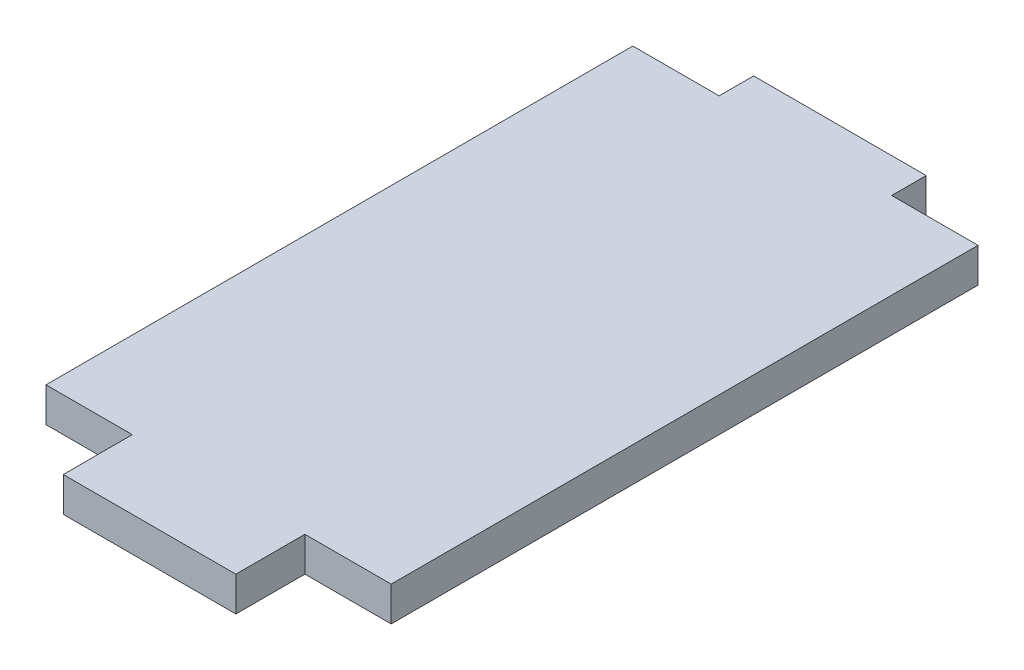
ISO-10303-21;
HEADER;
FILE_DESCRIPTION(('STEP AP214'),'2;1');
FILE_NAME('part.step','',(''),(''),'','','');
FILE_SCHEMA(('AUTOMOTIVE_DESIGN { 1 0 10303 214 1 1 1 1 }'));
ENDSEC;
DATA;
#1=APPLICATION_CONTEXT('core data for automotive mechanical design processes');
#2=APPLICATION_PROTOCOL_DEFINITION('international standard','automotive_design',2000,#1);
#3=PRODUCT_CONTEXT('',#1,'mechanical');
#4=PRODUCT('Part','Part','',(#3));
#5=PRODUCT_RELATED_PRODUCT_CATEGORY('part','',(#4));
#6=PRODUCT_DEFINITION_FORMATION('','',#4);
#7=PRODUCT_DEFINITION_CONTEXT('part definition',#1,'design');
#8=PRODUCT_DEFINITION('design','',#6,#7);
#9=PRODUCT_DEFINITION_SHAPE('','',#8);
#10=(LENGTH_UNIT() NAMED_UNIT(*) SI_UNIT(.MILLI.,.METRE.));
#11=(NAMED_UNIT(*) PLANE_ANGLE_UNIT() SI_UNIT($,.RADIAN.));
#12=(NAMED_UNIT(*) SI_UNIT($,.STERADIAN.) SOLID_ANGLE_UNIT());
#13=UNCERTAINTY_MEASURE_WITH_UNIT(LENGTH_MEASURE(1.E-05),#10,'distance_accuracy_value','');
#14=(GEOMETRIC_REPRESENTATION_CONTEXT(3) GLOBAL_UNCERTAINTY_ASSIGNED_CONTEXT((#13)) GLOBAL_UNIT_ASSIGNED_CONTEXT((#10,
#11,#12)) REPRESENTATION_CONTEXT('',''));
#15=CARTESIAN_POINT('',(0.,0.,0.));
#16=DIRECTION('',(0.,0.,1.));
#17=DIRECTION('',(1.,0.,0.));
#18=AXIS2_PLACEMENT_3D('',#15,#16,#17);
#19=CARTESIAN_POINT('',(0.,3.,31.5));
#20=DIRECTION('',(0.,0.,1.));
#21=DIRECTION('',(1.,0.,0.));
#22=AXIS2_PLACEMENT_3D('',#19,#20,#21);
#23=PLANE('',#22);
#24=DIRECTION('',(-1.,0.,0.));
#25=VECTOR('',#24,1.);
#26=CARTESIAN_POINT('',(0.,0.,31.5));
#27=LINE('',#26,#25);
#28=CARTESIAN_POINT('',(7.5,0.,31.5));
#29=VERTEX_POINT('',#28);
#30=CARTESIAN_POINT('',(-7.5,0.,31.5));
#31=VERTEX_POINT('',#30);
#32=EDGE_CURVE('E151',#29,#31,#27,.T.);
#33=ORIENTED_EDGE('',*,*,#32,.F.);
#34=DIRECTION('',(0.,-1.,0.));
#35=VECTOR('',#34,1.);
#36=CARTESIAN_POINT('',(7.5,3.,31.5));
#37=LINE('',#36,#35);
#38=CARTESIAN_POINT('',(7.5,3.,31.5));
#39=VERTEX_POINT('',#38);
#40=EDGE_CURVE('E11',#39,#29,#37,.T.);
#41=ORIENTED_EDGE('',*,*,#40,.F.);
#42=DIRECTION('',(-1.,0.,0.));
#43=VECTOR('',#42,1.);
#44=CARTESIAN_POINT('',(0.,3.,31.5));
#45=LINE('',#44,#43);
#46=CARTESIAN_POINT('',(-7.5,3.,31.5));
#47=VERTEX_POINT('',#46);
#48=EDGE_CURVE('E180',#39,#47,#45,.T.);
#49=ORIENTED_EDGE('',*,*,#48,.T.);
#50=DIRECTION('',(0.,-1.,0.));
#51=VECTOR('',#50,1.);
#52=CARTESIAN_POINT('',(-7.5,3.,31.5));
#53=LINE('',#52,#51);
#54=EDGE_CURVE('E97',#47,#31,#53,.T.);
#55=ORIENTED_EDGE('',*,*,#54,.T.);
#56=EDGE_LOOP('',(#33,#41,#49,#55));
#57=FACE_BOUND('',#56,.T.);
#58=ADVANCED_FACE('F35',(#57),#23,.T.);
#59=CARTESIAN_POINT('',(7.5,3.,0.));
#60=DIRECTION('',(1.,0.,0.));
#61=DIRECTION('',(0.,0.,-1.));
#62=AXIS2_PLACEMENT_3D('',#59,#60,#61);
#63=PLANE('',#62);
#64=DIRECTION('',(0.,0.,1.));
#65=VECTOR('',#64,1.);
#66=CARTESIAN_POINT('',(7.5,0.,0.));
#67=LINE('',#66,#65);
#68=CARTESIAN_POINT('',(7.5,0.,25.5));
#69=VERTEX_POINT('',#68);
#70=EDGE_CURVE('E154',#69,#29,#67,.T.);
#71=ORIENTED_EDGE('',*,*,#70,.F.);
#72=DIRECTION('',(0.,-1.,0.));
#73=VECTOR('',#72,1.);
#74=CARTESIAN_POINT('',(7.5,3.,25.5));
#75=LINE('',#74,#73);
#76=CARTESIAN_POINT('',(7.5,3.,25.5));
#77=VERTEX_POINT('',#76);
#78=EDGE_CURVE('E43',#77,#69,#75,.T.);
#79=ORIENTED_EDGE('',*,*,#78,.F.);
#80=DIRECTION('',(0.,0.,1.));
#81=VECTOR('',#80,1.);
#82=CARTESIAN_POINT('',(7.5,3.,0.));
#83=LINE('',#82,#81);
#84=EDGE_CURVE('E245',#77,#39,#83,.T.);
#85=ORIENTED_EDGE('',*,*,#84,.T.);
#86=ORIENTED_EDGE('',*,*,#40,.T.);
#87=EDGE_LOOP('',(#71,#79,#85,#86));
#88=FACE_BOUND('',#87,.T.);
#89=ADVANCED_FACE('F208',(#88),#63,.T.);
#90=CARTESIAN_POINT('',(0.,3.,25.5));
#91=DIRECTION('',(0.,0.,1.));
#92=DIRECTION('',(1.,0.,0.));
#93=AXIS2_PLACEMENT_3D('',#90,#91,#92);
#94=PLANE('',#93);
#95=DIRECTION('',(-1.,0.,0.));
#96=VECTOR('',#95,1.);
#97=CARTESIAN_POINT('',(0.,0.,25.5));
#98=LINE('',#97,#96);
#99=CARTESIAN_POINT('',(15.,0.,25.5));
#100=VERTEX_POINT('',#99);
#101=EDGE_CURVE('E157',#100,#69,#98,.T.);
#102=ORIENTED_EDGE('',*,*,#101,.F.);
#103=DIRECTION('',(0.,-1.,0.));
#104=VECTOR('',#103,1.);
#105=CARTESIAN_POINT('',(15.,3.,25.5));
#106=LINE('',#105,#104);
#107=CARTESIAN_POINT('',(15.,3.,25.5));
#108=VERTEX_POINT('',#107);
#109=EDGE_CURVE('E197',#108,#100,#106,.T.);
#110=ORIENTED_EDGE('',*,*,#109,.F.);
#111=DIRECTION('',(-1.,0.,0.));
#112=VECTOR('',#111,1.);
#113=CARTESIAN_POINT('',(0.,3.,25.5));
#114=LINE('',#113,#112);
#115=EDGE_CURVE('E204',#108,#77,#114,.T.);
#116=ORIENTED_EDGE('',*,*,#115,.T.);
#117=ORIENTED_EDGE('',*,*,#78,.T.);
#118=EDGE_LOOP('',(#102,#110,#116,#117));
#119=FACE_BOUND('',#118,.T.);
#120=ADVANCED_FACE('F202',(#119),#94,.T.);
#121=CARTESIAN_POINT('',(15.,3.,0.));
#122=DIRECTION('',(-1.,0.,0.));
#123=DIRECTION('',(0.,0.,1.));
#124=AXIS2_PLACEMENT_3D('',#121,#122,#123);
#125=PLANE('',#124);
#126=DIRECTION('',(0.,0.,-1.));
#127=VECTOR('',#126,1.);
#128=CARTESIAN_POINT('',(15.,0.,0.));
#129=LINE('',#128,#127);
#130=CARTESIAN_POINT('',(15.,0.,-25.5));
#131=VERTEX_POINT('',#130);
#132=EDGE_CURVE('E160',#100,#131,#129,.T.);
#133=ORIENTED_EDGE('',*,*,#132,.T.);
#134=DIRECTION('',(0.,-1.,0.));
#135=VECTOR('',#134,1.);
#136=CARTESIAN_POINT('',(15.,3.,-25.5));
#137=LINE('',#136,#135);
#138=CARTESIAN_POINT('',(15.,3.,-25.5));
#139=VERTEX_POINT('',#138);
#140=EDGE_CURVE('E194',#139,#131,#137,.T.);
#141=ORIENTED_EDGE('',*,*,#140,.F.);
#142=DIRECTION('',(0.,0.,-1.));
#143=VECTOR('',#142,1.);
#144=CARTESIAN_POINT('',(15.,3.,0.));
#145=LINE('',#144,#143);
#146=EDGE_CURVE('E225',#108,#139,#145,.T.);
#147=ORIENTED_EDGE('',*,*,#146,.F.);
#148=ORIENTED_EDGE('',*,*,#109,.T.);
#149=EDGE_LOOP('',(#133,#141,#147,#148));
#150=FACE_BOUND('',#149,.T.);
#151=ADVANCED_FACE('F215',(#150),#125,.F.);
#152=CARTESIAN_POINT('',(0.,3.,-25.5));
#153=DIRECTION('',(0.,0.,1.));
#154=DIRECTION('',(1.,0.,0.));
#155=AXIS2_PLACEMENT_3D('',#152,#153,#154);
#156=PLANE('',#155);
#157=DIRECTION('',(-1.,0.,0.));
#158=VECTOR('',#157,1.);
#159=CARTESIAN_POINT('',(0.,0.,-25.5));
#160=LINE('',#159,#158);
#161=CARTESIAN_POINT('',(7.5,0.,-25.5));
#162=VERTEX_POINT('',#161);
#163=EDGE_CURVE('E162',#131,#162,#160,.T.);
#164=ORIENTED_EDGE('',*,*,#163,.T.);
#165=DIRECTION('',(0.,-1.,0.));
#166=VECTOR('',#165,1.);
#167=CARTESIAN_POINT('',(7.5,3.,-25.5));
#168=LINE('',#167,#166);
#169=CARTESIAN_POINT('',(7.5,3.,-25.5));
#170=VERTEX_POINT('',#169);
#171=EDGE_CURVE('E192',#170,#162,#168,.T.);
#172=ORIENTED_EDGE('',*,*,#171,.F.);
#173=DIRECTION('',(-1.,0.,0.));
#174=VECTOR('',#173,1.);
#175=CARTESIAN_POINT('',(0.,3.,-25.5));
#176=LINE('',#175,#174);
#177=EDGE_CURVE('E221',#139,#170,#176,.T.);
#178=ORIENTED_EDGE('',*,*,#177,.F.);
#179=ORIENTED_EDGE('',*,*,#140,.T.);
#180=EDGE_LOOP('',(#164,#172,#178,#179));
#181=FACE_BOUND('',#180,.T.);
#182=ADVANCED_FACE('F219',(#181),#156,.F.);
#183=CARTESIAN_POINT('',(7.5,3.,0.));
#184=DIRECTION('',(1.,0.,0.));
#185=DIRECTION('',(0.,0.,-1.));
#186=AXIS2_PLACEMENT_3D('',#183,#184,#185);
#187=PLANE('',#186);
#188=DIRECTION('',(0.,0.,1.));
#189=VECTOR('',#188,1.);
#190=CARTESIAN_POINT('',(7.5,0.,0.));
#191=LINE('',#190,#189);
#192=CARTESIAN_POINT('',(7.5,0.,-28.5));
#193=VERTEX_POINT('',#192);
#194=EDGE_CURVE('E165',#193,#162,#191,.T.);
#195=ORIENTED_EDGE('',*,*,#194,.F.);
#196=DIRECTION('',(0.,-1.,0.));
#197=VECTOR('',#196,1.);
#198=CARTESIAN_POINT('',(7.5,3.,-28.5));
#199=LINE('',#198,#197);
#200=CARTESIAN_POINT('',(7.5,3.,-28.5));
#201=VERTEX_POINT('',#200);
#202=EDGE_CURVE('E190',#201,#193,#199,.T.);
#203=ORIENTED_EDGE('',*,*,#202,.F.);
#204=DIRECTION('',(0.,0.,1.));
#205=VECTOR('',#204,1.);
#206=CARTESIAN_POINT('',(7.5,3.,0.));
#207=LINE('',#206,#205);
#208=EDGE_CURVE('E224',#201,#170,#207,.T.);
#209=ORIENTED_EDGE('',*,*,#208,.T.);
#210=ORIENTED_EDGE('',*,*,#171,.T.);
#211=EDGE_LOOP('',(#195,#203,#209,#210));
#212=FACE_BOUND('',#211,.T.);
#213=ADVANCED_FACE('F261',(#212),#187,.T.);
#214=CARTESIAN_POINT('',(0.,3.,-28.5));
#215=DIRECTION('',(0.,0.,1.));
#216=DIRECTION('',(1.,0.,0.));
#217=AXIS2_PLACEMENT_3D('',#214,#215,#216);
#218=PLANE('',#217);
#219=DIRECTION('',(-1.,0.,0.));
#220=VECTOR('',#219,1.);
#221=CARTESIAN_POINT('',(0.,0.,-28.5));
#222=LINE('',#221,#220);
#223=CARTESIAN_POINT('',(-7.5,0.,-28.5));
#224=VERTEX_POINT('',#223);
#225=EDGE_CURVE('E168',#193,#224,#222,.T.);
#226=ORIENTED_EDGE('',*,*,#225,.T.);
#227=DIRECTION('',(0.,-1.,0.));
#228=VECTOR('',#227,1.);
#229=CARTESIAN_POINT('',(-7.5,3.,-28.5));
#230=LINE('',#229,#228);
#231=CARTESIAN_POINT('',(-7.5,3.,-28.5));
#232=VERTEX_POINT('',#231);
#233=EDGE_CURVE('E187',#232,#224,#230,.T.);
#234=ORIENTED_EDGE('',*,*,#233,.F.);
#235=DIRECTION('',(-1.,0.,0.));
#236=VECTOR('',#235,1.);
#237=CARTESIAN_POINT('',(0.,3.,-28.5));
#238=LINE('',#237,#236);
#239=EDGE_CURVE('E227',#201,#232,#238,.T.);
#240=ORIENTED_EDGE('',*,*,#239,.F.);
#241=ORIENTED_EDGE('',*,*,#202,.T.);
#242=EDGE_LOOP('',(#226,#234,#240,#241));
#243=FACE_BOUND('',#242,.T.);
#244=ADVANCED_FACE('F264',(#243),#218,.F.);
#245=CARTESIAN_POINT('',(-7.5,3.,0.));
#246=DIRECTION('',(1.,0.,0.));
#247=DIRECTION('',(0.,0.,-1.));
#248=AXIS2_PLACEMENT_3D('',#245,#246,#247);
#249=PLANE('',#248);
#250=DIRECTION('',(0.,0.,1.));
#251=VECTOR('',#250,1.);
#252=CARTESIAN_POINT('',(-7.5,0.,0.));
#253=LINE('',#252,#251);
#254=CARTESIAN_POINT('',(-7.5,0.,-25.5));
#255=VERTEX_POINT('',#254);
#256=EDGE_CURVE('E170',#224,#255,#253,.T.);
#257=ORIENTED_EDGE('',*,*,#256,.T.);
#258=DIRECTION('',(0.,-1.,0.));
#259=VECTOR('',#258,1.);
#260=CARTESIAN_POINT('',(-7.5,3.,-25.5));
#261=LINE('',#260,#259);
#262=CARTESIAN_POINT('',(-7.5,3.,-25.5));
#263=VERTEX_POINT('',#262);
#264=EDGE_CURVE('E184',#263,#255,#261,.T.);
#265=ORIENTED_EDGE('',*,*,#264,.F.);
#266=DIRECTION('',(0.,0.,1.));
#267=VECTOR('',#266,1.);
#268=CARTESIAN_POINT('',(-7.5,3.,0.));
#269=LINE('',#268,#267);
#270=EDGE_CURVE('E233',#232,#263,#269,.T.);
#271=ORIENTED_EDGE('',*,*,#270,.F.);
#272=ORIENTED_EDGE('',*,*,#233,.T.);
#273=EDGE_LOOP('',(#257,#265,#271,#272));
#274=FACE_BOUND('',#273,.T.);
#275=ADVANCED_FACE('F239',(#274),#249,.F.);
#276=CARTESIAN_POINT('',(0.,3.,-25.5));
#277=DIRECTION('',(0.,0.,1.));
#278=DIRECTION('',(1.,0.,0.));
#279=AXIS2_PLACEMENT_3D('',#276,#277,#278);
#280=PLANE('',#279);
#281=DIRECTION('',(-1.,0.,0.));
#282=VECTOR('',#281,1.);
#283=CARTESIAN_POINT('',(0.,0.,-25.5));
#284=LINE('',#283,#282);
#285=CARTESIAN_POINT('',(-15.,0.,-25.5));
#286=VERTEX_POINT('',#285);
#287=EDGE_CURVE('E172',#255,#286,#284,.T.);
#288=ORIENTED_EDGE('',*,*,#287,.T.);
#289=DIRECTION('',(0.,-1.,0.));
#290=VECTOR('',#289,1.);
#291=CARTESIAN_POINT('',(-15.,3.,-25.5));
#292=LINE('',#291,#290);
#293=CARTESIAN_POINT('',(-15.,3.,-25.5));
#294=VERTEX_POINT('',#293);
#295=EDGE_CURVE('E138',#294,#286,#292,.T.);
#296=ORIENTED_EDGE('',*,*,#295,.F.);
#297=DIRECTION('',(-1.,0.,0.));
#298=VECTOR('',#297,1.);
#299=CARTESIAN_POINT('',(0.,3.,-25.5));
#300=LINE('',#299,#298);
#301=EDGE_CURVE('E143',#263,#294,#300,.T.);
#302=ORIENTED_EDGE('',*,*,#301,.F.);
#303=ORIENTED_EDGE('',*,*,#264,.T.);
#304=EDGE_LOOP('',(#288,#296,#302,#303));
#305=FACE_BOUND('',#304,.T.);
#306=ADVANCED_FACE('F243',(#305),#280,.F.);
#307=CARTESIAN_POINT('',(-15.,3.,0.));
#308=DIRECTION('',(-1.,0.,0.));
#309=DIRECTION('',(0.,0.,1.));
#310=AXIS2_PLACEMENT_3D('',#307,#308,#309);
#311=PLANE('',#310);
#312=DIRECTION('',(0.,0.,-1.));
#313=VECTOR('',#312,1.);
#314=CARTESIAN_POINT('',(-15.,0.,0.));
#315=LINE('',#314,#313);
#316=CARTESIAN_POINT('',(-15.,0.,25.5));
#317=VERTEX_POINT('',#316);
#318=EDGE_CURVE('E133',#317,#286,#315,.T.);
#319=ORIENTED_EDGE('',*,*,#318,.F.);
#320=DIRECTION('',(0.,-1.,0.));
#321=VECTOR('',#320,1.);
#322=CARTESIAN_POINT('',(-15.,3.,25.5));
#323=LINE('',#322,#321);
#324=CARTESIAN_POINT('',(-15.,3.,25.5));
#325=VERTEX_POINT('',#324);
#326=EDGE_CURVE('E128',#325,#317,#323,.T.);
#327=ORIENTED_EDGE('',*,*,#326,.F.);
#328=DIRECTION('',(0.,0.,-1.));
#329=VECTOR('',#328,1.);
#330=CARTESIAN_POINT('',(-15.,3.,0.));
#331=LINE('',#330,#329);
#332=EDGE_CURVE('E131',#325,#294,#331,.T.);
#333=ORIENTED_EDGE('',*,*,#332,.T.);
#334=ORIENTED_EDGE('',*,*,#295,.T.);
#335=EDGE_LOOP('',(#319,#327,#333,#334));
#336=FACE_BOUND('',#335,.T.);
#337=ADVANCED_FACE('F130',(#336),#311,.T.);
#338=CARTESIAN_POINT('',(0.,3.,25.5));
#339=DIRECTION('',(0.,0.,1.));
#340=DIRECTION('',(1.,0.,0.));
#341=AXIS2_PLACEMENT_3D('',#338,#339,#340);
#342=PLANE('',#341);
#343=DIRECTION('',(-1.,0.,0.));
#344=VECTOR('',#343,1.);
#345=CARTESIAN_POINT('',(0.,0.,25.5));
#346=LINE('',#345,#344);
#347=CARTESIAN_POINT('',(-7.5,0.,25.5));
#348=VERTEX_POINT('',#347);
#349=EDGE_CURVE('E176',#348,#317,#346,.T.);
#350=ORIENTED_EDGE('',*,*,#349,.F.);
#351=DIRECTION('',(0.,-1.,0.));
#352=VECTOR('',#351,1.);
#353=CARTESIAN_POINT('',(-7.5,3.,25.5));
#354=LINE('',#353,#352);
#355=CARTESIAN_POINT('',(-7.5,3.,25.5));
#356=VERTEX_POINT('',#355);
#357=EDGE_CURVE('E90',#356,#348,#354,.T.);
#358=ORIENTED_EDGE('',*,*,#357,.F.);
#359=DIRECTION('',(-1.,0.,0.));
#360=VECTOR('',#359,1.);
#361=CARTESIAN_POINT('',(0.,3.,25.5));
#362=LINE('',#361,#360);
#363=EDGE_CURVE('E141',#356,#325,#362,.T.);
#364=ORIENTED_EDGE('',*,*,#363,.T.);
#365=ORIENTED_EDGE('',*,*,#326,.T.);
#366=EDGE_LOOP('',(#350,#358,#364,#365));
#367=FACE_BOUND('',#366,.T.);
#368=ADVANCED_FACE('F146',(#367),#342,.T.);
#369=CARTESIAN_POINT('',(-7.5,3.,0.));
#370=DIRECTION('',(1.,0.,0.));
#371=DIRECTION('',(0.,0.,-1.));
#372=AXIS2_PLACEMENT_3D('',#369,#370,#371);
#373=PLANE('',#372);
#374=DIRECTION('',(0.,0.,1.));
#375=VECTOR('',#374,1.);
#376=CARTESIAN_POINT('',(-7.5,0.,0.));
#377=LINE('',#376,#375);
#378=EDGE_CURVE('E178',#348,#31,#377,.T.);
#379=ORIENTED_EDGE('',*,*,#378,.T.);
#380=ORIENTED_EDGE('',*,*,#54,.F.);
#381=DIRECTION('',(0.,0.,1.));
#382=VECTOR('',#381,1.);
#383=CARTESIAN_POINT('',(-7.5,3.,0.));
#384=LINE('',#383,#382);
#385=EDGE_CURVE('E51',#356,#47,#384,.T.);
#386=ORIENTED_EDGE('',*,*,#385,.F.);
#387=ORIENTED_EDGE('',*,*,#357,.T.);
#388=EDGE_LOOP('',(#379,#380,#386,#387));
#389=FACE_BOUND('',#388,.T.);
#390=ADVANCED_FACE('F244',(#389),#373,.F.);
#391=CARTESIAN_POINT('',(0.,3.,0.));
#392=DIRECTION('',(0.,1.,0.));
#393=DIRECTION('',(0.,0.,1.));
#394=AXIS2_PLACEMENT_3D('',#391,#392,#393);
#395=PLANE('',#394);
#396=ORIENTED_EDGE('',*,*,#48,.F.);
#397=ORIENTED_EDGE('',*,*,#84,.F.);
#398=ORIENTED_EDGE('',*,*,#115,.F.);
#399=ORIENTED_EDGE('',*,*,#146,.T.);
#400=ORIENTED_EDGE('',*,*,#177,.T.);
#401=ORIENTED_EDGE('',*,*,#208,.F.);
#402=ORIENTED_EDGE('',*,*,#239,.T.);
#403=ORIENTED_EDGE('',*,*,#270,.T.);
#404=ORIENTED_EDGE('',*,*,#301,.T.);
#405=ORIENTED_EDGE('',*,*,#332,.F.);
#406=ORIENTED_EDGE('',*,*,#363,.F.);
#407=ORIENTED_EDGE('',*,*,#385,.T.);
#408=EDGE_LOOP('',(#396,#397,#398,#399,#400,#401,#402,#403,#404,#405,#406,#407));
#409=FACE_BOUND('',#408,.T.);
#410=ADVANCED_FACE('F140',(#409),#395,.T.);
#411=CARTESIAN_POINT('',(0.,0.,0.));
#412=DIRECTION('',(0.,1.,0.));
#413=DIRECTION('',(0.,0.,1.));
#414=AXIS2_PLACEMENT_3D('',#411,#412,#413);
#415=PLANE('',#414);
#416=ORIENTED_EDGE('',*,*,#32,.T.);
#417=ORIENTED_EDGE('',*,*,#378,.F.);
#418=ORIENTED_EDGE('',*,*,#349,.T.);
#419=ORIENTED_EDGE('',*,*,#318,.T.);
#420=ORIENTED_EDGE('',*,*,#287,.F.);
#421=ORIENTED_EDGE('',*,*,#256,.F.);
#422=ORIENTED_EDGE('',*,*,#225,.F.);
#423=ORIENTED_EDGE('',*,*,#194,.T.);
#424=ORIENTED_EDGE('',*,*,#163,.F.);
#425=ORIENTED_EDGE('',*,*,#132,.F.);
#426=ORIENTED_EDGE('',*,*,#101,.T.);
#427=ORIENTED_EDGE('',*,*,#70,.T.);
#428=EDGE_LOOP('',(#416,#417,#418,#419,#420,#421,#422,#423,#424,#425,#426,#427));
#429=FACE_BOUND('',#428,.T.);
#430=ADVANCED_FACE('F211',(#429),#415,.F.);
#431=CLOSED_SHELL('',(#58,#89,#120,#151,#182,#213,#244,#275,#306,#337,#368,#390,#410,#430));
#432=MANIFOLD_SOLID_BREP('B2',#431);
#433=ADVANCED_BREP_SHAPE_REPRESENTATION('',(#18,#432),#14);
#434=SHAPE_DEFINITION_REPRESENTATION(#9,#433);
ENDSEC;
END-ISO-10303-21;
